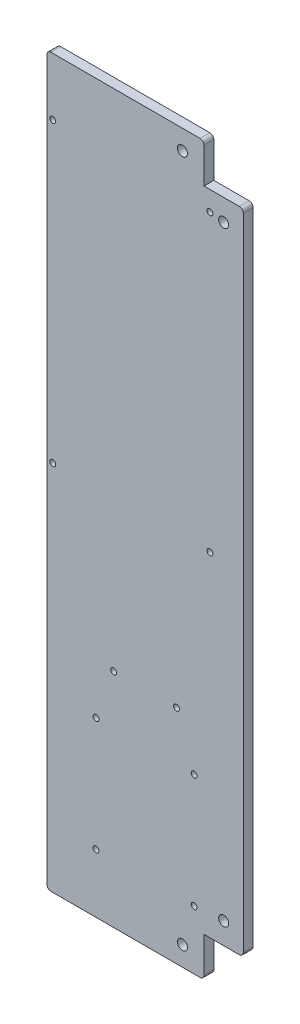
ISO-10303-21;
HEADER;
FILE_DESCRIPTION(('STEP AP214'),'2;1');
FILE_NAME('part.step','',(''),(''),'','','');
FILE_SCHEMA(('AUTOMOTIVE_DESIGN { 1 0 10303 214 1 1 1 1 }'));
ENDSEC;
DATA;
#1=APPLICATION_CONTEXT('core data for automotive mechanical design processes');
#2=APPLICATION_PROTOCOL_DEFINITION('international standard','automotive_design',2000,#1);
#3=PRODUCT_CONTEXT('',#1,'mechanical');
#4=PRODUCT('Part','Part','',(#3));
#5=PRODUCT_RELATED_PRODUCT_CATEGORY('part','',(#4));
#6=PRODUCT_DEFINITION_FORMATION('','',#4);
#7=PRODUCT_DEFINITION_CONTEXT('part definition',#1,'design');
#8=PRODUCT_DEFINITION('design','',#6,#7);
#9=PRODUCT_DEFINITION_SHAPE('','',#8);
#10=(LENGTH_UNIT() NAMED_UNIT(*) SI_UNIT(.MILLI.,.METRE.));
#11=(NAMED_UNIT(*) PLANE_ANGLE_UNIT() SI_UNIT($,.RADIAN.));
#12=(NAMED_UNIT(*) SI_UNIT($,.STERADIAN.) SOLID_ANGLE_UNIT());
#13=UNCERTAINTY_MEASURE_WITH_UNIT(LENGTH_MEASURE(1.E-05),#10,'distance_accuracy_value','');
#14=(GEOMETRIC_REPRESENTATION_CONTEXT(3) GLOBAL_UNCERTAINTY_ASSIGNED_CONTEXT((#13)) GLOBAL_UNIT_ASSIGNED_CONTEXT((#10,
#11,#12)) REPRESENTATION_CONTEXT('',''));
#15=CARTESIAN_POINT('',(0.,0.,0.));
#16=DIRECTION('',(0.,0.,1.));
#17=DIRECTION('',(1.,0.,0.));
#18=AXIS2_PLACEMENT_3D('',#15,#16,#17);
#19=CARTESIAN_POINT('',(0.,0.,2.5));
#20=DIRECTION('',(0.,0.,1.));
#21=DIRECTION('',(1.,0.,0.));
#22=AXIS2_PLACEMENT_3D('',#19,#20,#21);
#23=PLANE('',#22);
#24=CARTESIAN_POINT('',(-16.,-71.9999999999997,2.5));
#25=DIRECTION('',(0.,0.,1.));
#26=DIRECTION('',(1.,0.,0.));
#27=AXIS2_PLACEMENT_3D('',#24,#25,#26);
#28=CIRCLE('',#27,1.5);
#29=CARTESIAN_POINT('',(-17.5,-71.9999999999997,2.5));
#30=VERTEX_POINT('',#29);
#31=EDGE_CURVE('E477',#30,#30,#28,.F.);
#32=ORIENTED_EDGE('',*,*,#31,.T.);
#33=EDGE_LOOP('',(#32));
#34=FACE_BOUND('',#33,.T.);
#35=CARTESIAN_POINT('',(19.0000000000886,174.999999999955,2.5));
#36=DIRECTION('',(0.,0.,-1.));
#37=DIRECTION('',(-1.,0.,0.));
#38=AXIS2_PLACEMENT_3D('',#35,#36,#37);
#39=CIRCLE('',#38,2.55000000009726);
#40=CARTESIAN_POINT('',(16.4499999999913,174.999999999955,2.5));
#41=VERTEX_POINT('',#40);
#42=EDGE_CURVE('E185',#41,#41,#39,.T.);
#43=ORIENTED_EDGE('',*,*,#42,.T.);
#44=EDGE_LOOP('',(#43));
#45=FACE_BOUND('',#44,.T.);
#46=CARTESIAN_POINT('',(40.0000000002187,153.999999999926,2.5));
#47=DIRECTION('',(0.,0.,-1.));
#48=DIRECTION('',(-1.,0.,0.));
#49=AXIS2_PLACEMENT_3D('',#46,#47,#48);
#50=CIRCLE('',#49,2.55000000023076);
#51=CARTESIAN_POINT('',(37.4499999999879,153.999999999926,2.5));
#52=VERTEX_POINT('',#51);
#53=EDGE_CURVE('E459',#52,#52,#50,.T.);
#54=ORIENTED_EDGE('',*,*,#53,.T.);
#55=EDGE_LOOP('',(#54));
#56=FACE_BOUND('',#55,.T.);
#57=CARTESIAN_POINT('',(40.0000000002186,-154.000000000055,2.5));
#58=DIRECTION('',(0.,0.,-1.));
#59=DIRECTION('',(-1.,0.,0.));
#60=AXIS2_PLACEMENT_3D('',#57,#58,#59);
#61=CIRCLE('',#60,2.55000000022515);
#62=CARTESIAN_POINT('',(37.4499999999934,-154.000000000055,2.5));
#63=VERTEX_POINT('',#62);
#64=EDGE_CURVE('E451',#63,#63,#61,.T.);
#65=ORIENTED_EDGE('',*,*,#64,.T.);
#66=EDGE_LOOP('',(#65));
#67=FACE_BOUND('',#66,.T.);
#68=CARTESIAN_POINT('',(19.0000000002103,-175.000000000055,2.5));
#69=DIRECTION('',(0.,0.,-1.));
#70=DIRECTION('',(-1.,0.,0.));
#71=AXIS2_PLACEMENT_3D('',#68,#69,#70);
#72=CIRCLE('',#71,2.55000000021739);
#73=CARTESIAN_POINT('',(16.4499999999929,-175.000000000055,2.5));
#74=VERTEX_POINT('',#73);
#75=EDGE_CURVE('E442',#74,#74,#72,.T.);
#76=ORIENTED_EDGE('',*,*,#75,.T.);
#77=EDGE_LOOP('',(#76));
#78=FACE_BOUND('',#77,.T.);
#79=CARTESIAN_POINT('',(-25.,-155.,2.5));
#80=DIRECTION('',(0.,0.,1.));
#81=DIRECTION('',(-1.,0.,0.));
#82=AXIS2_PLACEMENT_3D('',#79,#80,#81);
#83=CIRCLE('',#82,1.5);
#84=CARTESIAN_POINT('',(-26.5,-155.,2.5));
#85=VERTEX_POINT('',#84);
#86=EDGE_CURVE('E202',#85,#85,#83,.T.);
#87=ORIENTED_EDGE('',*,*,#86,.F.);
#88=EDGE_LOOP('',(#87));
#89=FACE_BOUND('',#88,.T.);
#90=CARTESIAN_POINT('',(25.,-96.9999999999997,2.5));
#91=DIRECTION('',(0.,0.,1.));
#92=DIRECTION('',(-1.,0.,0.));
#93=AXIS2_PLACEMENT_3D('',#90,#91,#92);
#94=CIRCLE('',#93,1.5);
#95=CARTESIAN_POINT('',(23.5,-96.9999999999997,2.5));
#96=VERTEX_POINT('',#95);
#97=EDGE_CURVE('E211',#96,#96,#94,.T.);
#98=ORIENTED_EDGE('',*,*,#97,.F.);
#99=EDGE_LOOP('',(#98));
#100=FACE_BOUND('',#99,.T.);
#101=CARTESIAN_POINT('',(-25.,-96.9999999999997,2.5));
#102=DIRECTION('',(0.,0.,1.));
#103=DIRECTION('',(1.,0.,0.));
#104=AXIS2_PLACEMENT_3D('',#101,#102,#103);
#105=CIRCLE('',#104,1.5);
#106=CARTESIAN_POINT('',(-23.5,-96.9999999999997,2.5));
#107=VERTEX_POINT('',#106);
#108=EDGE_CURVE('E176',#107,#107,#105,.T.);
#109=ORIENTED_EDGE('',*,*,#108,.F.);
#110=EDGE_LOOP('',(#109));
#111=FACE_BOUND('',#110,.T.);
#112=CARTESIAN_POINT('',(25.,-155.,2.5));
#113=DIRECTION('',(0.,0.,1.));
#114=DIRECTION('',(1.,0.,0.));
#115=AXIS2_PLACEMENT_3D('',#112,#113,#114);
#116=CIRCLE('',#115,1.5);
#117=CARTESIAN_POINT('',(26.5,-155.,2.5));
#118=VERTEX_POINT('',#117);
#119=EDGE_CURVE('E206',#118,#118,#116,.T.);
#120=ORIENTED_EDGE('',*,*,#119,.F.);
#121=EDGE_LOOP('',(#120));
#122=FACE_BOUND('',#121,.T.);
#123=CARTESIAN_POINT('',(-47.,155.654762379244,2.5));
#124=DIRECTION('',(0.,0.,1.));
#125=DIRECTION('',(-1.,0.,0.));
#126=AXIS2_PLACEMENT_3D('',#123,#124,#125);
#127=CIRCLE('',#126,1.5);
#128=CARTESIAN_POINT('',(-48.5,155.654762379244,2.5));
#129=VERTEX_POINT('',#128);
#130=EDGE_CURVE('E234',#129,#129,#127,.T.);
#131=ORIENTED_EDGE('',*,*,#130,.F.);
#132=EDGE_LOOP('',(#131));
#133=FACE_BOUND('',#132,.T.);
#134=CARTESIAN_POINT('',(33.,5.,2.5));
#135=DIRECTION('',(0.,0.,1.));
#136=DIRECTION('',(-1.,0.,0.));
#137=AXIS2_PLACEMENT_3D('',#134,#135,#136);
#138=CIRCLE('',#137,1.5);
#139=CARTESIAN_POINT('',(31.5,5.,2.5));
#140=VERTEX_POINT('',#139);
#141=EDGE_CURVE('E243',#140,#140,#138,.T.);
#142=ORIENTED_EDGE('',*,*,#141,.F.);
#143=EDGE_LOOP('',(#142));
#144=FACE_BOUND('',#143,.T.);
#145=CARTESIAN_POINT('',(-47.,4.34523762075609,2.5));
#146=DIRECTION('',(0.,0.,1.));
#147=DIRECTION('',(1.,0.,0.));
#148=AXIS2_PLACEMENT_3D('',#145,#146,#147);
#149=CIRCLE('',#148,1.5);
#150=CARTESIAN_POINT('',(-45.5,4.34523762075609,2.5));
#151=VERTEX_POINT('',#150);
#152=EDGE_CURVE('E226',#151,#151,#149,.T.);
#153=ORIENTED_EDGE('',*,*,#152,.F.);
#154=EDGE_LOOP('',(#153));
#155=FACE_BOUND('',#154,.T.);
#156=CARTESIAN_POINT('',(33.,155.,2.5));
#157=DIRECTION('',(0.,0.,1.));
#158=DIRECTION('',(1.,0.,0.));
#159=AXIS2_PLACEMENT_3D('',#156,#157,#158);
#160=CIRCLE('',#159,1.5);
#161=CARTESIAN_POINT('',(34.5,155.,2.5));
#162=VERTEX_POINT('',#161);
#163=EDGE_CURVE('E238',#162,#162,#160,.T.);
#164=ORIENTED_EDGE('',*,*,#163,.F.);
#165=EDGE_LOOP('',(#164));
#166=FACE_BOUND('',#165,.T.);
#167=DIRECTION('',(1.,0.,0.));
#168=VECTOR('',#167,1.);
#169=CARTESIAN_POINT('',(50.,-185.,2.5));
#170=LINE('',#169,#168);
#171=CARTESIAN_POINT('',(-48.,-185.,2.5));
#172=VERTEX_POINT('',#171);
#173=CARTESIAN_POINT('',(28.,-185.,2.5));
#174=VERTEX_POINT('',#173);
#175=EDGE_CURVE('E262',#172,#174,#170,.T.);
#176=ORIENTED_EDGE('',*,*,#175,.T.);
#177=CARTESIAN_POINT('',(28.,-183.,2.5));
#178=DIRECTION('',(0.,0.,1.));
#179=DIRECTION('',(1.,0.,0.));
#180=AXIS2_PLACEMENT_3D('',#177,#178,#179);
#181=CIRCLE('',#180,2.);
#182=CARTESIAN_POINT('',(30.,-183.,2.5));
#183=VERTEX_POINT('',#182);
#184=EDGE_CURVE('E308',#174,#183,#181,.T.);
#185=ORIENTED_EDGE('',*,*,#184,.T.);
#186=DIRECTION('',(0.,1.,0.));
#187=VECTOR('',#186,1.);
#188=CARTESIAN_POINT('',(30.,-185.,2.5));
#189=LINE('',#188,#187);
#190=CARTESIAN_POINT('',(30.,-165.,2.5));
#191=VERTEX_POINT('',#190);
#192=EDGE_CURVE('E164',#183,#191,#189,.T.);
#193=ORIENTED_EDGE('',*,*,#192,.T.);
#194=DIRECTION('',(-1.,0.,0.));
#195=VECTOR('',#194,1.);
#196=CARTESIAN_POINT('',(50.,-165.,2.5));
#197=LINE('',#196,#195);
#198=CARTESIAN_POINT('',(48.,-165.,2.5));
#199=VERTEX_POINT('',#198);
#200=EDGE_CURVE('E186',#199,#191,#197,.T.);
#201=ORIENTED_EDGE('',*,*,#200,.F.);
#202=CARTESIAN_POINT('',(48.,-163.,2.5));
#203=DIRECTION('',(0.,0.,1.));
#204=DIRECTION('',(1.,0.,0.));
#205=AXIS2_PLACEMENT_3D('',#202,#203,#204);
#206=CIRCLE('',#205,2.);
#207=CARTESIAN_POINT('',(50.,-163.,2.5));
#208=VERTEX_POINT('',#207);
#209=EDGE_CURVE('E305',#199,#208,#206,.T.);
#210=ORIENTED_EDGE('',*,*,#209,.T.);
#211=DIRECTION('',(0.,1.,0.));
#212=VECTOR('',#211,1.);
#213=CARTESIAN_POINT('',(50.,-185.,2.5));
#214=LINE('',#213,#212);
#215=CARTESIAN_POINT('',(50.,163.,2.5));
#216=VERTEX_POINT('',#215);
#217=EDGE_CURVE('E266',#208,#216,#214,.T.);
#218=ORIENTED_EDGE('',*,*,#217,.T.);
#219=CARTESIAN_POINT('',(48.,163.,2.5));
#220=DIRECTION('',(0.,0.,1.));
#221=DIRECTION('',(1.,0.,0.));
#222=AXIS2_PLACEMENT_3D('',#219,#220,#221);
#223=CIRCLE('',#222,2.);
#224=CARTESIAN_POINT('',(48.,165.,2.5));
#225=VERTEX_POINT('',#224);
#226=EDGE_CURVE('E160',#216,#225,#223,.T.);
#227=ORIENTED_EDGE('',*,*,#226,.T.);
#228=DIRECTION('',(-1.,0.,0.));
#229=VECTOR('',#228,1.);
#230=CARTESIAN_POINT('',(50.,165.,2.5));
#231=LINE('',#230,#229);
#232=CARTESIAN_POINT('',(30.,165.,2.5));
#233=VERTEX_POINT('',#232);
#234=EDGE_CURVE('E154',#225,#233,#231,.T.);
#235=ORIENTED_EDGE('',*,*,#234,.T.);
#236=DIRECTION('',(0.,-1.,0.));
#237=VECTOR('',#236,1.);
#238=CARTESIAN_POINT('',(30.,185.,2.5));
#239=LINE('',#238,#237);
#240=CARTESIAN_POINT('',(30.,183.,2.5));
#241=VERTEX_POINT('',#240);
#242=EDGE_CURVE('E144',#241,#233,#239,.T.);
#243=ORIENTED_EDGE('',*,*,#242,.F.);
#244=CARTESIAN_POINT('',(28.,183.,2.5));
#245=DIRECTION('',(0.,0.,1.));
#246=DIRECTION('',(1.,0.,0.));
#247=AXIS2_PLACEMENT_3D('',#244,#245,#246);
#248=CIRCLE('',#247,2.);
#249=CARTESIAN_POINT('',(28.,185.,2.5));
#250=VERTEX_POINT('',#249);
#251=EDGE_CURVE('E300',#241,#250,#248,.T.);
#252=ORIENTED_EDGE('',*,*,#251,.T.);
#253=DIRECTION('',(-1.,0.,0.));
#254=VECTOR('',#253,1.);
#255=CARTESIAN_POINT('',(50.,185.,2.5));
#256=LINE('',#255,#254);
#257=CARTESIAN_POINT('',(-48.,185.,2.5));
#258=VERTEX_POINT('',#257);
#259=EDGE_CURVE('E269',#250,#258,#256,.T.);
#260=ORIENTED_EDGE('',*,*,#259,.T.);
#261=CARTESIAN_POINT('',(-48.,183.,2.5));
#262=DIRECTION('',(0.,0.,1.));
#263=DIRECTION('',(1.,0.,0.));
#264=AXIS2_PLACEMENT_3D('',#261,#262,#263);
#265=CIRCLE('',#264,2.);
#266=CARTESIAN_POINT('',(-50.,183.,2.5));
#267=VERTEX_POINT('',#266);
#268=EDGE_CURVE('E294',#258,#267,#265,.T.);
#269=ORIENTED_EDGE('',*,*,#268,.T.);
#270=DIRECTION('',(0.,-1.,0.));
#271=VECTOR('',#270,1.);
#272=CARTESIAN_POINT('',(-50.,-185.,2.5));
#273=LINE('',#272,#271);
#274=CARTESIAN_POINT('',(-50.,-183.,2.5));
#275=VERTEX_POINT('',#274);
#276=EDGE_CURVE('E258',#267,#275,#273,.T.);
#277=ORIENTED_EDGE('',*,*,#276,.T.);
#278=CARTESIAN_POINT('',(-48.,-183.,2.5));
#279=DIRECTION('',(0.,0.,1.));
#280=DIRECTION('',(1.,0.,0.));
#281=AXIS2_PLACEMENT_3D('',#278,#279,#280);
#282=CIRCLE('',#281,2.);
#283=EDGE_CURVE('E297',#275,#172,#282,.T.);
#284=ORIENTED_EDGE('',*,*,#283,.T.);
#285=EDGE_LOOP('',(#176,#185,#193,#201,#210,#218,#227,#235,#243,#252,#260,#269,#277,#284));
#286=FACE_BOUND('',#285,.T.);
#287=CARTESIAN_POINT('',(16.,-71.9999999999997,2.5));
#288=DIRECTION('',(0.,0.,1.));
#289=DIRECTION('',(1.,0.,0.));
#290=AXIS2_PLACEMENT_3D('',#287,#288,#289);
#291=CIRCLE('',#290,1.5);
#292=CARTESIAN_POINT('',(14.5,-71.9999999999997,2.5));
#293=VERTEX_POINT('',#292);
#294=EDGE_CURVE('E447',#293,#293,#291,.T.);
#295=ORIENTED_EDGE('',*,*,#294,.F.);
#296=EDGE_LOOP('',(#295));
#297=FACE_BOUND('',#296,.T.);
#298=ADVANCED_FACE('F42',(#34,#45,#56,#67,#78,#89,#100,#111,#122,#133,#144,#155,#166,#286,#297),
#23,.T.);
#299=CARTESIAN_POINT('',(0.,0.,-2.5));
#300=DIRECTION('',(0.,0.,1.));
#301=DIRECTION('',(1.,0.,0.));
#302=AXIS2_PLACEMENT_3D('',#299,#300,#301);
#303=PLANE('',#302);
#304=DIRECTION('',(0.,1.,0.));
#305=VECTOR('',#304,1.);
#306=CARTESIAN_POINT('',(30.,-185.,-2.5));
#307=LINE('',#306,#305);
#308=CARTESIAN_POINT('',(30.,-183.,-2.5));
#309=VERTEX_POINT('',#308);
#310=CARTESIAN_POINT('',(30.,-165.,-2.5));
#311=VERTEX_POINT('',#310);
#312=EDGE_CURVE('E189',#309,#311,#307,.T.);
#313=ORIENTED_EDGE('',*,*,#312,.F.);
#314=CARTESIAN_POINT('',(28.,-183.,-2.5));
#315=DIRECTION('',(0.,0.,1.));
#316=DIRECTION('',(1.,0.,0.));
#317=AXIS2_PLACEMENT_3D('',#314,#315,#316);
#318=CIRCLE('',#317,2.);
#319=CARTESIAN_POINT('',(28.,-185.,-2.5));
#320=VERTEX_POINT('',#319);
#321=EDGE_CURVE('E327',#309,#320,#318,.F.);
#322=ORIENTED_EDGE('',*,*,#321,.T.);
#323=DIRECTION('',(1.,0.,0.));
#324=VECTOR('',#323,1.);
#325=CARTESIAN_POINT('',(50.,-185.,-2.5));
#326=LINE('',#325,#324);
#327=CARTESIAN_POINT('',(-48.,-185.,-2.5));
#328=VERTEX_POINT('',#327);
#329=EDGE_CURVE('E277',#328,#320,#326,.T.);
#330=ORIENTED_EDGE('',*,*,#329,.F.);
#331=CARTESIAN_POINT('',(-48.,-183.,-2.5));
#332=DIRECTION('',(0.,0.,1.));
#333=DIRECTION('',(1.,0.,0.));
#334=AXIS2_PLACEMENT_3D('',#331,#332,#333);
#335=CIRCLE('',#334,2.);
#336=CARTESIAN_POINT('',(-50.,-183.,-2.5));
#337=VERTEX_POINT('',#336);
#338=EDGE_CURVE('E316',#328,#337,#335,.F.);
#339=ORIENTED_EDGE('',*,*,#338,.T.);
#340=DIRECTION('',(0.,-1.,0.));
#341=VECTOR('',#340,1.);
#342=CARTESIAN_POINT('',(-50.,-185.,-2.5));
#343=LINE('',#342,#341);
#344=CARTESIAN_POINT('',(-50.,183.,-2.5));
#345=VERTEX_POINT('',#344);
#346=EDGE_CURVE('E254',#345,#337,#343,.T.);
#347=ORIENTED_EDGE('',*,*,#346,.F.);
#348=CARTESIAN_POINT('',(-48.,183.,-2.5));
#349=DIRECTION('',(0.,0.,1.));
#350=DIRECTION('',(1.,0.,0.));
#351=AXIS2_PLACEMENT_3D('',#348,#349,#350);
#352=CIRCLE('',#351,2.);
#353=CARTESIAN_POINT('',(-48.,185.,-2.5));
#354=VERTEX_POINT('',#353);
#355=EDGE_CURVE('E64',#345,#354,#352,.F.);
#356=ORIENTED_EDGE('',*,*,#355,.T.);
#357=DIRECTION('',(-1.,0.,0.));
#358=VECTOR('',#357,1.);
#359=CARTESIAN_POINT('',(50.,185.,-2.5));
#360=LINE('',#359,#358);
#361=CARTESIAN_POINT('',(28.,185.,-2.5));
#362=VERTEX_POINT('',#361);
#363=EDGE_CURVE('E263',#362,#354,#360,.T.);
#364=ORIENTED_EDGE('',*,*,#363,.F.);
#365=CARTESIAN_POINT('',(28.,183.,-2.5));
#366=DIRECTION('',(0.,0.,1.));
#367=DIRECTION('',(1.,0.,0.));
#368=AXIS2_PLACEMENT_3D('',#365,#366,#367);
#369=CIRCLE('',#368,2.);
#370=CARTESIAN_POINT('',(30.,183.,-2.5));
#371=VERTEX_POINT('',#370);
#372=EDGE_CURVE('E58',#362,#371,#369,.F.);
#373=ORIENTED_EDGE('',*,*,#372,.T.);
#374=DIRECTION('',(0.,-1.,0.));
#375=VECTOR('',#374,1.);
#376=CARTESIAN_POINT('',(30.,185.,-2.5));
#377=LINE('',#376,#375);
#378=CARTESIAN_POINT('',(30.,165.,-2.5));
#379=VERTEX_POINT('',#378);
#380=EDGE_CURVE('E171',#371,#379,#377,.T.);
#381=ORIENTED_EDGE('',*,*,#380,.T.);
#382=DIRECTION('',(-1.,0.,0.));
#383=VECTOR('',#382,1.);
#384=CARTESIAN_POINT('',(50.,165.,-2.5));
#385=LINE('',#384,#383);
#386=CARTESIAN_POINT('',(48.,165.,-2.5));
#387=VERTEX_POINT('',#386);
#388=EDGE_CURVE('E153',#387,#379,#385,.T.);
#389=ORIENTED_EDGE('',*,*,#388,.F.);
#390=CARTESIAN_POINT('',(48.,163.,-2.5));
#391=DIRECTION('',(0.,0.,1.));
#392=DIRECTION('',(1.,0.,0.));
#393=AXIS2_PLACEMENT_3D('',#390,#391,#392);
#394=CIRCLE('',#393,2.);
#395=CARTESIAN_POINT('',(50.,163.,-2.5));
#396=VERTEX_POINT('',#395);
#397=EDGE_CURVE('E321',#387,#396,#394,.F.);
#398=ORIENTED_EDGE('',*,*,#397,.T.);
#399=DIRECTION('',(0.,1.,0.));
#400=VECTOR('',#399,1.);
#401=CARTESIAN_POINT('',(50.,-185.,-2.5));
#402=LINE('',#401,#400);
#403=CARTESIAN_POINT('',(50.,-163.,-2.5));
#404=VERTEX_POINT('',#403);
#405=EDGE_CURVE('E281',#404,#396,#402,.T.);
#406=ORIENTED_EDGE('',*,*,#405,.F.);
#407=CARTESIAN_POINT('',(48.,-163.,-2.5));
#408=DIRECTION('',(0.,0.,1.));
#409=DIRECTION('',(1.,0.,0.));
#410=AXIS2_PLACEMENT_3D('',#407,#408,#409);
#411=CIRCLE('',#410,2.);
#412=CARTESIAN_POINT('',(48.,-165.,-2.5));
#413=VERTEX_POINT('',#412);
#414=EDGE_CURVE('E324',#404,#413,#411,.F.);
#415=ORIENTED_EDGE('',*,*,#414,.T.);
#416=DIRECTION('',(-1.,0.,0.));
#417=VECTOR('',#416,1.);
#418=CARTESIAN_POINT('',(50.,-165.,-2.5));
#419=LINE('',#418,#417);
#420=EDGE_CURVE('E184',#413,#311,#419,.T.);
#421=ORIENTED_EDGE('',*,*,#420,.T.);
#422=EDGE_LOOP('',(#313,#322,#330,#339,#347,#356,#364,#373,#381,#389,#398,#406,#415,#421));
#423=FACE_BOUND('',#422,.T.);
#424=CARTESIAN_POINT('',(33.,155.,-2.5));
#425=DIRECTION('',(0.,0.,1.));
#426=DIRECTION('',(1.,0.,0.));
#427=AXIS2_PLACEMENT_3D('',#424,#425,#426);
#428=CIRCLE('',#427,1.5);
#429=CARTESIAN_POINT('',(34.5,155.,-2.5));
#430=VERTEX_POINT('',#429);
#431=EDGE_CURVE('E250',#430,#430,#428,.T.);
#432=ORIENTED_EDGE('',*,*,#431,.T.);
#433=EDGE_LOOP('',(#432));
#434=FACE_BOUND('',#433,.T.);
#435=CARTESIAN_POINT('',(-47.,4.34523762075609,-2.5));
#436=DIRECTION('',(0.,0.,1.));
#437=DIRECTION('',(1.,0.,0.));
#438=AXIS2_PLACEMENT_3D('',#435,#436,#437);
#439=CIRCLE('',#438,1.5);
#440=CARTESIAN_POINT('',(-45.5,4.34523762075609,-2.5));
#441=VERTEX_POINT('',#440);
#442=EDGE_CURVE('E222',#441,#441,#439,.T.);
#443=ORIENTED_EDGE('',*,*,#442,.T.);
#444=EDGE_LOOP('',(#443));
#445=FACE_BOUND('',#444,.T.);
#446=CARTESIAN_POINT('',(33.,5.,-2.5));
#447=DIRECTION('',(0.,0.,1.));
#448=DIRECTION('',(-1.,0.,0.));
#449=AXIS2_PLACEMENT_3D('',#446,#447,#448);
#450=CIRCLE('',#449,1.5);
#451=CARTESIAN_POINT('',(31.5,5.,-2.5));
#452=VERTEX_POINT('',#451);
#453=EDGE_CURVE('E230',#452,#452,#450,.T.);
#454=ORIENTED_EDGE('',*,*,#453,.T.);
#455=EDGE_LOOP('',(#454));
#456=FACE_BOUND('',#455,.T.);
#457=CARTESIAN_POINT('',(-47.,155.654762379244,-2.5));
#458=DIRECTION('',(0.,0.,1.));
#459=DIRECTION('',(-1.,0.,0.));
#460=AXIS2_PLACEMENT_3D('',#457,#458,#459);
#461=CIRCLE('',#460,1.5);
#462=CARTESIAN_POINT('',(-48.5,155.654762379244,-2.5));
#463=VERTEX_POINT('',#462);
#464=EDGE_CURVE('E239',#463,#463,#461,.T.);
#465=ORIENTED_EDGE('',*,*,#464,.T.);
#466=EDGE_LOOP('',(#465));
#467=FACE_BOUND('',#466,.T.);
#468=CARTESIAN_POINT('',(25.,-155.,-2.5));
#469=DIRECTION('',(0.,0.,1.));
#470=DIRECTION('',(1.,0.,0.));
#471=AXIS2_PLACEMENT_3D('',#468,#469,#470);
#472=CIRCLE('',#471,1.5);
#473=CARTESIAN_POINT('',(26.5,-155.,-2.5));
#474=VERTEX_POINT('',#473);
#475=EDGE_CURVE('E218',#474,#474,#472,.T.);
#476=ORIENTED_EDGE('',*,*,#475,.T.);
#477=EDGE_LOOP('',(#476));
#478=FACE_BOUND('',#477,.T.);
#479=CARTESIAN_POINT('',(-25.,-96.9999999999997,-2.5));
#480=DIRECTION('',(0.,0.,1.));
#481=DIRECTION('',(1.,0.,0.));
#482=AXIS2_PLACEMENT_3D('',#479,#480,#481);
#483=CIRCLE('',#482,1.5);
#484=CARTESIAN_POINT('',(-23.5,-96.9999999999997,-2.5));
#485=VERTEX_POINT('',#484);
#486=EDGE_CURVE('E170',#485,#485,#483,.T.);
#487=ORIENTED_EDGE('',*,*,#486,.T.);
#488=EDGE_LOOP('',(#487));
#489=FACE_BOUND('',#488,.T.);
#490=CARTESIAN_POINT('',(25.,-96.9999999999997,-2.5));
#491=DIRECTION('',(0.,0.,1.));
#492=DIRECTION('',(-1.,0.,0.));
#493=AXIS2_PLACEMENT_3D('',#490,#491,#492);
#494=CIRCLE('',#493,1.5);
#495=CARTESIAN_POINT('',(23.5,-96.9999999999997,-2.5));
#496=VERTEX_POINT('',#495);
#497=EDGE_CURVE('E200',#496,#496,#494,.T.);
#498=ORIENTED_EDGE('',*,*,#497,.T.);
#499=EDGE_LOOP('',(#498));
#500=FACE_BOUND('',#499,.T.);
#501=CARTESIAN_POINT('',(-25.,-155.,-2.5));
#502=DIRECTION('',(0.,0.,1.));
#503=DIRECTION('',(-1.,0.,0.));
#504=AXIS2_PLACEMENT_3D('',#501,#502,#503);
#505=CIRCLE('',#504,1.5);
#506=CARTESIAN_POINT('',(-26.5,-155.,-2.5));
#507=VERTEX_POINT('',#506);
#508=EDGE_CURVE('E207',#507,#507,#505,.T.);
#509=ORIENTED_EDGE('',*,*,#508,.T.);
#510=EDGE_LOOP('',(#509));
#511=FACE_BOUND('',#510,.T.);
#512=CARTESIAN_POINT('',(19.0000000002103,-175.000000000055,-2.5));
#513=DIRECTION('',(0.,0.,-1.));
#514=DIRECTION('',(-1.,0.,0.));
#515=AXIS2_PLACEMENT_3D('',#512,#513,#514);
#516=CIRCLE('',#515,2.55000000021739);
#517=CARTESIAN_POINT('',(16.4499999999929,-175.000000000055,-2.5));
#518=VERTEX_POINT('',#517);
#519=EDGE_CURVE('E446',#518,#518,#516,.T.);
#520=ORIENTED_EDGE('',*,*,#519,.F.);
#521=EDGE_LOOP('',(#520));
#522=FACE_BOUND('',#521,.T.);
#523=CARTESIAN_POINT('',(40.0000000002186,-154.000000000055,-2.5));
#524=DIRECTION('',(0.,0.,-1.));
#525=DIRECTION('',(-1.,0.,0.));
#526=AXIS2_PLACEMENT_3D('',#523,#524,#525);
#527=CIRCLE('',#526,2.55000000022515);
#528=CARTESIAN_POINT('',(37.4499999999934,-154.000000000055,-2.5));
#529=VERTEX_POINT('',#528);
#530=EDGE_CURVE('E455',#529,#529,#527,.T.);
#531=ORIENTED_EDGE('',*,*,#530,.F.);
#532=EDGE_LOOP('',(#531));
#533=FACE_BOUND('',#532,.T.);
#534=CARTESIAN_POINT('',(40.0000000002187,153.999999999926,-2.5));
#535=DIRECTION('',(0.,0.,-1.));
#536=DIRECTION('',(-1.,0.,0.));
#537=AXIS2_PLACEMENT_3D('',#534,#535,#536);
#538=CIRCLE('',#537,2.55000000023076);
#539=CARTESIAN_POINT('',(37.4499999999879,153.999999999926,-2.5));
#540=VERTEX_POINT('',#539);
#541=EDGE_CURVE('E463',#540,#540,#538,.T.);
#542=ORIENTED_EDGE('',*,*,#541,.F.);
#543=EDGE_LOOP('',(#542));
#544=FACE_BOUND('',#543,.T.);
#545=CARTESIAN_POINT('',(19.0000000000886,174.999999999955,-2.5));
#546=DIRECTION('',(0.,0.,-1.));
#547=DIRECTION('',(-1.,0.,0.));
#548=AXIS2_PLACEMENT_3D('',#545,#546,#547);
#549=CIRCLE('',#548,2.55000000009726);
#550=CARTESIAN_POINT('',(16.4499999999913,174.999999999955,-2.5));
#551=VERTEX_POINT('',#550);
#552=EDGE_CURVE('E467',#551,#551,#549,.T.);
#553=ORIENTED_EDGE('',*,*,#552,.F.);
#554=EDGE_LOOP('',(#553));
#555=FACE_BOUND('',#554,.T.);
#556=CARTESIAN_POINT('',(-16.,-71.9999999999997,-2.5));
#557=DIRECTION('',(0.,0.,-1.));
#558=DIRECTION('',(-1.,0.,0.));
#559=AXIS2_PLACEMENT_3D('',#556,#557,#558);
#560=CIRCLE('',#559,1.5);
#561=CARTESIAN_POINT('',(-17.5,-71.9999999999997,-2.5));
#562=VERTEX_POINT('',#561);
#563=EDGE_CURVE('E481',#562,#562,#560,.F.);
#564=ORIENTED_EDGE('',*,*,#563,.T.);
#565=EDGE_LOOP('',(#564));
#566=FACE_BOUND('',#565,.T.);
#567=CARTESIAN_POINT('',(16.,-71.9999999999997,-2.5));
#568=DIRECTION('',(0.,0.,-1.));
#569=DIRECTION('',(-1.,0.,0.));
#570=AXIS2_PLACEMENT_3D('',#567,#568,#569);
#571=CIRCLE('',#570,1.5);
#572=CARTESIAN_POINT('',(14.5,-71.9999999999997,-2.5));
#573=VERTEX_POINT('',#572);
#574=EDGE_CURVE('E480',#573,#573,#571,.T.);
#575=ORIENTED_EDGE('',*,*,#574,.F.);
#576=EDGE_LOOP('',(#575));
#577=FACE_BOUND('',#576,.T.);
#578=ADVANCED_FACE('F361',(#423,#434,#445,#456,#467,#478,#489,#500,#511,#522,#533,#544,#555,
#566,#577),#303,.F.);
#579=CARTESIAN_POINT('',(50.,-185.,2.5));
#580=DIRECTION('',(0.,1.,0.));
#581=DIRECTION('',(0.,0.,1.));
#582=AXIS2_PLACEMENT_3D('',#579,#580,#581);
#583=PLANE('',#582);
#584=ORIENTED_EDGE('',*,*,#329,.T.);
#585=DIRECTION('',(0.,0.,1.));
#586=VECTOR('',#585,1.);
#587=CARTESIAN_POINT('',(28.,-185.,2.5));
#588=LINE('',#587,#586);
#589=EDGE_CURVE('E290',#320,#174,#588,.T.);
#590=ORIENTED_EDGE('',*,*,#589,.T.);
#591=ORIENTED_EDGE('',*,*,#175,.F.);
#592=DIRECTION('',(0.,0.,-1.));
#593=VECTOR('',#592,1.);
#594=CARTESIAN_POINT('',(-48.,-185.,2.5));
#595=LINE('',#594,#593);
#596=EDGE_CURVE('E273',#172,#328,#595,.T.);
#597=ORIENTED_EDGE('',*,*,#596,.T.);
#598=EDGE_LOOP('',(#584,#590,#591,#597));
#599=FACE_BOUND('',#598,.T.);
#600=ADVANCED_FACE('F370',(#599),#583,.F.);
#601=CARTESIAN_POINT('',(50.,-185.,2.5));
#602=DIRECTION('',(-1.,0.,0.));
#603=DIRECTION('',(0.,0.,1.));
#604=AXIS2_PLACEMENT_3D('',#601,#602,#603);
#605=PLANE('',#604);
#606=ORIENTED_EDGE('',*,*,#217,.F.);
#607=DIRECTION('',(0.,0.,1.));
#608=VECTOR('',#607,1.);
#609=CARTESIAN_POINT('',(50.,-163.,2.5));
#610=LINE('',#609,#608);
#611=EDGE_CURVE('E338',#208,#404,#610,.F.);
#612=ORIENTED_EDGE('',*,*,#611,.T.);
#613=ORIENTED_EDGE('',*,*,#405,.T.);
#614=DIRECTION('',(0.,0.,1.));
#615=VECTOR('',#614,1.);
#616=CARTESIAN_POINT('',(50.,163.,2.5));
#617=LINE('',#616,#615);
#618=EDGE_CURVE('E334',#396,#216,#617,.T.);
#619=ORIENTED_EDGE('',*,*,#618,.T.);
#620=EDGE_LOOP('',(#606,#612,#613,#619));
#621=FACE_BOUND('',#620,.T.);
#622=ADVANCED_FACE('F406',(#621),#605,.F.);
#623=CARTESIAN_POINT('',(-50.,-185.,2.5));
#624=DIRECTION('',(1.,0.,0.));
#625=DIRECTION('',(0.,0.,-1.));
#626=AXIS2_PLACEMENT_3D('',#623,#624,#625);
#627=PLANE('',#626);
#628=ORIENTED_EDGE('',*,*,#346,.T.);
#629=DIRECTION('',(0.,0.,-1.));
#630=VECTOR('',#629,1.);
#631=CARTESIAN_POINT('',(-50.,-183.,2.5));
#632=LINE('',#631,#630);
#633=EDGE_CURVE('E11',#337,#275,#632,.F.);
#634=ORIENTED_EDGE('',*,*,#633,.T.);
#635=ORIENTED_EDGE('',*,*,#276,.F.);
#636=DIRECTION('',(0.,0.,-1.));
#637=VECTOR('',#636,1.);
#638=CARTESIAN_POINT('',(-50.,183.,2.5));
#639=LINE('',#638,#637);
#640=EDGE_CURVE('E51',#267,#345,#639,.T.);
#641=ORIENTED_EDGE('',*,*,#640,.T.);
#642=EDGE_LOOP('',(#628,#634,#635,#641));
#643=FACE_BOUND('',#642,.T.);
#644=ADVANCED_FACE('F356',(#643),#627,.F.);
#645=CARTESIAN_POINT('',(50.,185.,2.5));
#646=DIRECTION('',(0.,-1.,0.));
#647=DIRECTION('',(0.,0.,-1.));
#648=AXIS2_PLACEMENT_3D('',#645,#646,#647);
#649=PLANE('',#648);
#650=ORIENTED_EDGE('',*,*,#259,.F.);
#651=DIRECTION('',(0.,0.,1.));
#652=VECTOR('',#651,1.);
#653=CARTESIAN_POINT('',(28.,185.,2.5));
#654=LINE('',#653,#652);
#655=EDGE_CURVE('E349',#250,#362,#654,.F.);
#656=ORIENTED_EDGE('',*,*,#655,.T.);
#657=ORIENTED_EDGE('',*,*,#363,.T.);
#658=DIRECTION('',(0.,0.,-1.));
#659=VECTOR('',#658,1.);
#660=CARTESIAN_POINT('',(-48.,185.,2.5));
#661=LINE('',#660,#659);
#662=EDGE_CURVE('E346',#354,#258,#661,.F.);
#663=ORIENTED_EDGE('',*,*,#662,.T.);
#664=EDGE_LOOP('',(#650,#656,#657,#663));
#665=FACE_BOUND('',#664,.T.);
#666=ADVANCED_FACE('F376',(#665),#649,.F.);
#667=CARTESIAN_POINT('',(33.,155.,-2.5));
#668=DIRECTION('',(0.,0.,1.));
#669=DIRECTION('',(1.,0.,0.));
#670=AXIS2_PLACEMENT_3D('',#667,#668,#669);
#671=CYLINDRICAL_SURFACE('',#670,1.5);
#672=ORIENTED_EDGE('',*,*,#431,.F.);
#673=EDGE_LOOP('',(#672));
#674=FACE_BOUND('',#673,.T.);
#675=ORIENTED_EDGE('',*,*,#163,.T.);
#676=EDGE_LOOP('',(#675));
#677=FACE_BOUND('',#676,.T.);
#678=ADVANCED_FACE('F401',(#674,#677),#671,.F.);
#679=CARTESIAN_POINT('',(-47.,4.34523762075609,-2.5));
#680=DIRECTION('',(0.,0.,1.));
#681=DIRECTION('',(1.,0.,0.));
#682=AXIS2_PLACEMENT_3D('',#679,#680,#681);
#683=CYLINDRICAL_SURFACE('',#682,1.5);
#684=ORIENTED_EDGE('',*,*,#442,.F.);
#685=EDGE_LOOP('',(#684));
#686=FACE_BOUND('',#685,.T.);
#687=ORIENTED_EDGE('',*,*,#152,.T.);
#688=EDGE_LOOP('',(#687));
#689=FACE_BOUND('',#688,.T.);
#690=ADVANCED_FACE('F541',(#686,#689),#683,.F.);
#691=CARTESIAN_POINT('',(33.,5.,-2.5));
#692=DIRECTION('',(0.,0.,1.));
#693=DIRECTION('',(1.,0.,0.));
#694=AXIS2_PLACEMENT_3D('',#691,#692,#693);
#695=CYLINDRICAL_SURFACE('',#694,1.5);
#696=ORIENTED_EDGE('',*,*,#453,.F.);
#697=EDGE_LOOP('',(#696));
#698=FACE_BOUND('',#697,.T.);
#699=ORIENTED_EDGE('',*,*,#141,.T.);
#700=EDGE_LOOP('',(#699));
#701=FACE_BOUND('',#700,.T.);
#702=ADVANCED_FACE('F544',(#698,#701),#695,.F.);
#703=CARTESIAN_POINT('',(-47.,155.654762379244,-2.5));
#704=DIRECTION('',(0.,0.,1.));
#705=DIRECTION('',(1.,0.,0.));
#706=AXIS2_PLACEMENT_3D('',#703,#704,#705);
#707=CYLINDRICAL_SURFACE('',#706,1.5);
#708=ORIENTED_EDGE('',*,*,#464,.F.);
#709=EDGE_LOOP('',(#708));
#710=FACE_BOUND('',#709,.T.);
#711=ORIENTED_EDGE('',*,*,#130,.T.);
#712=EDGE_LOOP('',(#711));
#713=FACE_BOUND('',#712,.T.);
#714=ADVANCED_FACE('F539',(#710,#713),#707,.F.);
#715=CARTESIAN_POINT('',(25.,-155.,-2.5));
#716=DIRECTION('',(0.,0.,1.));
#717=DIRECTION('',(1.,0.,0.));
#718=AXIS2_PLACEMENT_3D('',#715,#716,#717);
#719=CYLINDRICAL_SURFACE('',#718,1.5);
#720=ORIENTED_EDGE('',*,*,#475,.F.);
#721=EDGE_LOOP('',(#720));
#722=FACE_BOUND('',#721,.T.);
#723=ORIENTED_EDGE('',*,*,#119,.T.);
#724=EDGE_LOOP('',(#723));
#725=FACE_BOUND('',#724,.T.);
#726=ADVANCED_FACE('F529',(#722,#725),#719,.F.);
#727=CARTESIAN_POINT('',(-25.,-96.9999999999997,-2.5));
#728=DIRECTION('',(0.,0.,1.));
#729=DIRECTION('',(1.,0.,0.));
#730=AXIS2_PLACEMENT_3D('',#727,#728,#729);
#731=CYLINDRICAL_SURFACE('',#730,1.5);
#732=ORIENTED_EDGE('',*,*,#486,.F.);
#733=EDGE_LOOP('',(#732));
#734=FACE_BOUND('',#733,.T.);
#735=ORIENTED_EDGE('',*,*,#108,.T.);
#736=EDGE_LOOP('',(#735));
#737=FACE_BOUND('',#736,.T.);
#738=ADVANCED_FACE('F525',(#734,#737),#731,.F.);
#739=CARTESIAN_POINT('',(25.,-96.9999999999997,-2.5));
#740=DIRECTION('',(0.,0.,1.));
#741=DIRECTION('',(1.,0.,0.));
#742=AXIS2_PLACEMENT_3D('',#739,#740,#741);
#743=CYLINDRICAL_SURFACE('',#742,1.5);
#744=ORIENTED_EDGE('',*,*,#497,.F.);
#745=EDGE_LOOP('',(#744));
#746=FACE_BOUND('',#745,.T.);
#747=ORIENTED_EDGE('',*,*,#97,.T.);
#748=EDGE_LOOP('',(#747));
#749=FACE_BOUND('',#748,.T.);
#750=ADVANCED_FACE('F528',(#746,#749),#743,.F.);
#751=CARTESIAN_POINT('',(-25.,-155.,-2.5));
#752=DIRECTION('',(0.,0.,1.));
#753=DIRECTION('',(1.,0.,0.));
#754=AXIS2_PLACEMENT_3D('',#751,#752,#753);
#755=CYLINDRICAL_SURFACE('',#754,1.5);
#756=ORIENTED_EDGE('',*,*,#508,.F.);
#757=EDGE_LOOP('',(#756));
#758=FACE_BOUND('',#757,.T.);
#759=ORIENTED_EDGE('',*,*,#86,.T.);
#760=EDGE_LOOP('',(#759));
#761=FACE_BOUND('',#760,.T.);
#762=ADVANCED_FACE('F522',(#758,#761),#755,.F.);
#763=CARTESIAN_POINT('',(30.,-185.,-2.5));
#764=DIRECTION('',(1.,0.,0.));
#765=DIRECTION('',(0.,1.,0.));
#766=AXIS2_PLACEMENT_3D('',#763,#764,#765);
#767=PLANE('',#766);
#768=ORIENTED_EDGE('',*,*,#192,.F.);
#769=DIRECTION('',(0.,0.,1.));
#770=VECTOR('',#769,1.);
#771=CARTESIAN_POINT('',(30.,-183.,-2.5));
#772=LINE('',#771,#770);
#773=EDGE_CURVE('E311',#183,#309,#772,.F.);
#774=ORIENTED_EDGE('',*,*,#773,.T.);
#775=ORIENTED_EDGE('',*,*,#312,.T.);
#776=DIRECTION('',(0.,0.,1.));
#777=VECTOR('',#776,1.);
#778=CARTESIAN_POINT('',(30.,-165.,-2.5));
#779=LINE('',#778,#777);
#780=EDGE_CURVE('E180',#311,#191,#779,.T.);
#781=ORIENTED_EDGE('',*,*,#780,.T.);
#782=EDGE_LOOP('',(#768,#774,#775,#781));
#783=FACE_BOUND('',#782,.T.);
#784=ADVANCED_FACE('F433',(#783),#767,.T.);
#785=CARTESIAN_POINT('',(50.,-165.,-2.5));
#786=DIRECTION('',(0.,1.,0.));
#787=DIRECTION('',(0.,0.,1.));
#788=AXIS2_PLACEMENT_3D('',#785,#786,#787);
#789=PLANE('',#788);
#790=ORIENTED_EDGE('',*,*,#420,.F.);
#791=DIRECTION('',(0.,0.,1.));
#792=VECTOR('',#791,1.);
#793=CARTESIAN_POINT('',(48.,-165.,-2.5));
#794=LINE('',#793,#792);
#795=EDGE_CURVE('E330',#413,#199,#794,.T.);
#796=ORIENTED_EDGE('',*,*,#795,.T.);
#797=ORIENTED_EDGE('',*,*,#200,.T.);
#798=ORIENTED_EDGE('',*,*,#780,.F.);
#799=EDGE_LOOP('',(#790,#796,#797,#798));
#800=FACE_BOUND('',#799,.T.);
#801=ADVANCED_FACE('F430',(#800),#789,.F.);
#802=CARTESIAN_POINT('',(50.,165.,-2.5));
#803=DIRECTION('',(0.,1.,0.));
#804=DIRECTION('',(0.,0.,1.));
#805=AXIS2_PLACEMENT_3D('',#802,#803,#804);
#806=PLANE('',#805);
#807=ORIENTED_EDGE('',*,*,#234,.F.);
#808=DIRECTION('',(0.,0.,1.));
#809=VECTOR('',#808,1.);
#810=CARTESIAN_POINT('',(48.,165.,-2.5));
#811=LINE('',#810,#809);
#812=EDGE_CURVE('E341',#225,#387,#811,.F.);
#813=ORIENTED_EDGE('',*,*,#812,.T.);
#814=ORIENTED_EDGE('',*,*,#388,.T.);
#815=DIRECTION('',(0.,0.,1.));
#816=VECTOR('',#815,1.);
#817=CARTESIAN_POINT('',(30.,165.,-2.5));
#818=LINE('',#817,#816);
#819=EDGE_CURVE('E148',#379,#233,#818,.T.);
#820=ORIENTED_EDGE('',*,*,#819,.T.);
#821=EDGE_LOOP('',(#807,#813,#814,#820));
#822=FACE_BOUND('',#821,.T.);
#823=ADVANCED_FACE('F167',(#822),#806,.T.);
#824=CARTESIAN_POINT('',(30.,185.,-2.5));
#825=DIRECTION('',(-1.,0.,0.));
#826=DIRECTION('',(0.,-1.,0.));
#827=AXIS2_PLACEMENT_3D('',#824,#825,#826);
#828=PLANE('',#827);
#829=ORIENTED_EDGE('',*,*,#380,.F.);
#830=DIRECTION('',(0.,0.,1.));
#831=VECTOR('',#830,1.);
#832=CARTESIAN_POINT('',(30.,183.,-2.5));
#833=LINE('',#832,#831);
#834=EDGE_CURVE('E150',#371,#241,#833,.T.);
#835=ORIENTED_EDGE('',*,*,#834,.T.);
#836=ORIENTED_EDGE('',*,*,#242,.T.);
#837=ORIENTED_EDGE('',*,*,#819,.F.);
#838=EDGE_LOOP('',(#829,#835,#836,#837));
#839=FACE_BOUND('',#838,.T.);
#840=ADVANCED_FACE('F146',(#839),#828,.F.);
#841=CARTESIAN_POINT('',(19.0000000002103,-175.000000000055,2.5));
#842=DIRECTION('',(0.,0.,-1.));
#843=DIRECTION('',(-1.,0.,0.));
#844=AXIS2_PLACEMENT_3D('',#841,#842,#843);
#845=CYLINDRICAL_SURFACE('',#844,2.55000000021739);
#846=ORIENTED_EDGE('',*,*,#75,.F.);
#847=EDGE_LOOP('',(#846));
#848=FACE_BOUND('',#847,.T.);
#849=ORIENTED_EDGE('',*,*,#519,.T.);
#850=EDGE_LOOP('',(#849));
#851=FACE_BOUND('',#850,.T.);
#852=ADVANCED_FACE('F511',(#848,#851),#845,.F.);
#853=CARTESIAN_POINT('',(40.0000000002186,-154.000000000055,2.5));
#854=DIRECTION('',(0.,0.,-1.));
#855=DIRECTION('',(-1.,0.,0.));
#856=AXIS2_PLACEMENT_3D('',#853,#854,#855);
#857=CYLINDRICAL_SURFACE('',#856,2.55000000022515);
#858=ORIENTED_EDGE('',*,*,#64,.F.);
#859=EDGE_LOOP('',(#858));
#860=FACE_BOUND('',#859,.T.);
#861=ORIENTED_EDGE('',*,*,#530,.T.);
#862=EDGE_LOOP('',(#861));
#863=FACE_BOUND('',#862,.T.);
#864=ADVANCED_FACE('F507',(#860,#863),#857,.F.);
#865=CARTESIAN_POINT('',(40.0000000002187,153.999999999926,2.5));
#866=DIRECTION('',(0.,0.,-1.));
#867=DIRECTION('',(-1.,0.,0.));
#868=AXIS2_PLACEMENT_3D('',#865,#866,#867);
#869=CYLINDRICAL_SURFACE('',#868,2.55000000023076);
#870=ORIENTED_EDGE('',*,*,#53,.F.);
#871=EDGE_LOOP('',(#870));
#872=FACE_BOUND('',#871,.T.);
#873=ORIENTED_EDGE('',*,*,#541,.T.);
#874=EDGE_LOOP('',(#873));
#875=FACE_BOUND('',#874,.T.);
#876=ADVANCED_FACE('F503',(#872,#875),#869,.F.);
#877=CARTESIAN_POINT('',(19.0000000000886,174.999999999955,2.5));
#878=DIRECTION('',(0.,0.,-1.));
#879=DIRECTION('',(-1.,0.,0.));
#880=AXIS2_PLACEMENT_3D('',#877,#878,#879);
#881=CYLINDRICAL_SURFACE('',#880,2.55000000009726);
#882=ORIENTED_EDGE('',*,*,#42,.F.);
#883=EDGE_LOOP('',(#882));
#884=FACE_BOUND('',#883,.T.);
#885=ORIENTED_EDGE('',*,*,#552,.T.);
#886=EDGE_LOOP('',(#885));
#887=FACE_BOUND('',#886,.T.);
#888=ADVANCED_FACE('F417',(#884,#887),#881,.F.);
#889=CARTESIAN_POINT('',(28.,-183.,2.5));
#890=DIRECTION('',(0.,0.,-1.));
#891=DIRECTION('',(-1.,0.,0.));
#892=AXIS2_PLACEMENT_3D('',#889,#890,#891);
#893=CYLINDRICAL_SURFACE('',#892,2.);
#894=ORIENTED_EDGE('',*,*,#321,.F.);
#895=ORIENTED_EDGE('',*,*,#773,.F.);
#896=ORIENTED_EDGE('',*,*,#184,.F.);
#897=ORIENTED_EDGE('',*,*,#589,.F.);
#898=EDGE_LOOP('',(#894,#895,#896,#897));
#899=FACE_BOUND('',#898,.T.);
#900=ADVANCED_FACE('F414',(#899),#893,.T.);
#901=CARTESIAN_POINT('',(48.,-163.,-2.5));
#902=DIRECTION('',(0.,0.,1.));
#903=DIRECTION('',(1.,0.,0.));
#904=AXIS2_PLACEMENT_3D('',#901,#902,#903);
#905=CYLINDRICAL_SURFACE('',#904,2.);
#906=ORIENTED_EDGE('',*,*,#414,.F.);
#907=ORIENTED_EDGE('',*,*,#611,.F.);
#908=ORIENTED_EDGE('',*,*,#209,.F.);
#909=ORIENTED_EDGE('',*,*,#795,.F.);
#910=EDGE_LOOP('',(#906,#907,#908,#909));
#911=FACE_BOUND('',#910,.T.);
#912=ADVANCED_FACE('F387',(#911),#905,.T.);
#913=CARTESIAN_POINT('',(48.,163.,2.5));
#914=DIRECTION('',(0.,0.,-1.));
#915=DIRECTION('',(-1.,0.,0.));
#916=AXIS2_PLACEMENT_3D('',#913,#914,#915);
#917=CYLINDRICAL_SURFACE('',#916,2.);
#918=ORIENTED_EDGE('',*,*,#397,.F.);
#919=ORIENTED_EDGE('',*,*,#812,.F.);
#920=ORIENTED_EDGE('',*,*,#226,.F.);
#921=ORIENTED_EDGE('',*,*,#618,.F.);
#922=EDGE_LOOP('',(#918,#919,#920,#921));
#923=FACE_BOUND('',#922,.T.);
#924=ADVANCED_FACE('F381',(#923),#917,.T.);
#925=CARTESIAN_POINT('',(28.,183.,-2.5));
#926=DIRECTION('',(0.,0.,1.));
#927=DIRECTION('',(1.,0.,0.));
#928=AXIS2_PLACEMENT_3D('',#925,#926,#927);
#929=CYLINDRICAL_SURFACE('',#928,2.);
#930=ORIENTED_EDGE('',*,*,#372,.F.);
#931=ORIENTED_EDGE('',*,*,#655,.F.);
#932=ORIENTED_EDGE('',*,*,#251,.F.);
#933=ORIENTED_EDGE('',*,*,#834,.F.);
#934=EDGE_LOOP('',(#930,#931,#932,#933));
#935=FACE_BOUND('',#934,.T.);
#936=ADVANCED_FACE('F379',(#935),#929,.T.);
#937=CARTESIAN_POINT('',(-48.,-183.,2.5));
#938=DIRECTION('',(0.,0.,-1.));
#939=DIRECTION('',(-1.,0.,0.));
#940=AXIS2_PLACEMENT_3D('',#937,#938,#939);
#941=CYLINDRICAL_SURFACE('',#940,2.);
#942=ORIENTED_EDGE('',*,*,#283,.F.);
#943=ORIENTED_EDGE('',*,*,#633,.F.);
#944=ORIENTED_EDGE('',*,*,#338,.F.);
#945=ORIENTED_EDGE('',*,*,#596,.F.);
#946=EDGE_LOOP('',(#942,#943,#944,#945));
#947=FACE_BOUND('',#946,.T.);
#948=ADVANCED_FACE('F367',(#947),#941,.T.);
#949=CARTESIAN_POINT('',(-48.,183.,2.5));
#950=DIRECTION('',(0.,0.,-1.));
#951=DIRECTION('',(-1.,0.,0.));
#952=AXIS2_PLACEMENT_3D('',#949,#950,#951);
#953=CYLINDRICAL_SURFACE('',#952,2.);
#954=ORIENTED_EDGE('',*,*,#268,.F.);
#955=ORIENTED_EDGE('',*,*,#662,.F.);
#956=ORIENTED_EDGE('',*,*,#355,.F.);
#957=ORIENTED_EDGE('',*,*,#640,.F.);
#958=EDGE_LOOP('',(#954,#955,#956,#957));
#959=FACE_BOUND('',#958,.T.);
#960=ADVANCED_FACE('F44',(#959),#953,.T.);
#961=CARTESIAN_POINT('',(-16.,-71.9999999999997,10.5));
#962=DIRECTION('',(0.,0.,-1.));
#963=DIRECTION('',(-1.,0.,0.));
#964=AXIS2_PLACEMENT_3D('',#961,#962,#963);
#965=CYLINDRICAL_SURFACE('',#964,1.5);
#966=CARTESIAN_POINT('',(-17.5,-71.9999999999997,2.5));
#967=CARTESIAN_POINT('',(-17.5,-71.9999999999997,2.44791666666667));
#968=CARTESIAN_POINT('',(-17.5,-71.9999999999997,2.39583333333333));
#969=CARTESIAN_POINT('',(-17.5,-71.9999999999997,2.29166666666667));
#970=CARTESIAN_POINT('',(-17.5,-71.9999999999997,2.23958333333333));
#971=CARTESIAN_POINT('',(-17.5,-71.9999999999997,2.13541666666667));
#972=CARTESIAN_POINT('',(-17.5,-71.9999999999997,2.08333333333333));
#973=CARTESIAN_POINT('',(-17.5,-71.9999999999997,1.97916666666667));
#974=CARTESIAN_POINT('',(-17.5,-71.9999999999997,1.92708333333333));
#975=CARTESIAN_POINT('',(-17.5,-71.9999999999997,1.82291666666667));
#976=CARTESIAN_POINT('',(-17.5,-71.9999999999997,1.77083333333333));
#977=CARTESIAN_POINT('',(-17.5,-71.9999999999997,1.66666666666667));
#978=CARTESIAN_POINT('',(-17.5,-71.9999999999997,1.61458333333333));
#979=CARTESIAN_POINT('',(-17.5,-71.9999999999997,1.51041666666667));
#980=CARTESIAN_POINT('',(-17.5,-71.9999999999997,1.45833333333333));
#981=CARTESIAN_POINT('',(-17.5,-71.9999999999997,1.35416666666667));
#982=CARTESIAN_POINT('',(-17.5,-71.9999999999997,1.30208333333333));
#983=CARTESIAN_POINT('',(-17.5,-71.9999999999997,1.19791666666667));
#984=CARTESIAN_POINT('',(-17.5,-71.9999999999997,1.14583333333333));
#985=CARTESIAN_POINT('',(-17.5,-71.9999999999997,1.04166666666667));
#986=CARTESIAN_POINT('',(-17.5,-71.9999999999997,0.989583333333334));
#987=CARTESIAN_POINT('',(-17.5,-71.9999999999997,0.885416666666668));
#988=CARTESIAN_POINT('',(-17.5,-71.9999999999997,0.833333333333334));
#989=CARTESIAN_POINT('',(-17.5,-71.9999999999997,0.729166666666667));
#990=CARTESIAN_POINT('',(-17.5,-71.9999999999997,0.677083333333334));
#991=CARTESIAN_POINT('',(-17.5,-71.9999999999997,0.572916666666667));
#992=CARTESIAN_POINT('',(-17.5,-71.9999999999997,0.520833333333334));
#993=CARTESIAN_POINT('',(-17.5,-71.9999999999997,0.416666666666667));
#994=CARTESIAN_POINT('',(-17.5,-71.9999999999997,0.364583333333334));
#995=CARTESIAN_POINT('',(-17.5,-71.9999999999997,0.260416666666667));
#996=CARTESIAN_POINT('',(-17.5,-71.9999999999997,0.208333333333334));
#997=CARTESIAN_POINT('',(-17.5,-71.9999999999997,0.104166666666667));
#998=CARTESIAN_POINT('',(-17.5,-71.9999999999997,0.0520833333333334));
#999=CARTESIAN_POINT('',(-17.5,-71.9999999999997,-0.0520833333333334));
#1000=CARTESIAN_POINT('',(-17.5,-71.9999999999997,-0.104166666666667));
#1001=CARTESIAN_POINT('',(-17.5,-71.9999999999997,-0.208333333333334));
#1002=CARTESIAN_POINT('',(-17.5,-71.9999999999997,-0.260416666666667));
#1003=CARTESIAN_POINT('',(-17.5,-71.9999999999997,-0.364583333333334));
#1004=CARTESIAN_POINT('',(-17.5,-71.9999999999997,-0.416666666666667));
#1005=CARTESIAN_POINT('',(-17.5,-71.9999999999997,-0.520833333333334));
#1006=CARTESIAN_POINT('',(-17.5,-71.9999999999997,-0.572916666666667));
#1007=CARTESIAN_POINT('',(-17.5,-71.9999999999997,-0.677083333333334));
#1008=CARTESIAN_POINT('',(-17.5,-71.9999999999997,-0.729166666666667));
#1009=CARTESIAN_POINT('',(-17.5,-71.9999999999997,-0.833333333333333));
#1010=CARTESIAN_POINT('',(-17.5,-71.9999999999997,-0.885416666666666));
#1011=CARTESIAN_POINT('',(-17.5,-71.9999999999997,-0.989583333333333));
#1012=CARTESIAN_POINT('',(-17.5,-71.9999999999997,-1.04166666666667));
#1013=CARTESIAN_POINT('',(-17.5,-71.9999999999997,-1.14583333333333));
#1014=CARTESIAN_POINT('',(-17.5,-71.9999999999997,-1.19791666666667));
#1015=CARTESIAN_POINT('',(-17.5,-71.9999999999997,-1.30208333333333));
#1016=CARTESIAN_POINT('',(-17.5,-71.9999999999997,-1.35416666666667));
#1017=CARTESIAN_POINT('',(-17.5,-71.9999999999997,-1.45833333333333));
#1018=CARTESIAN_POINT('',(-17.5,-71.9999999999997,-1.51041666666667));
#1019=CARTESIAN_POINT('',(-17.5,-71.9999999999997,-1.61458333333333));
#1020=CARTESIAN_POINT('',(-17.5,-71.9999999999997,-1.66666666666667));
#1021=CARTESIAN_POINT('',(-17.5,-71.9999999999997,-1.77083333333333));
#1022=CARTESIAN_POINT('',(-17.5,-71.9999999999997,-1.82291666666667));
#1023=CARTESIAN_POINT('',(-17.5,-71.9999999999997,-1.92708333333333));
#1024=CARTESIAN_POINT('',(-17.5,-71.9999999999997,-1.97916666666667));
#1025=CARTESIAN_POINT('',(-17.5,-71.9999999999997,-2.08333333333333));
#1026=CARTESIAN_POINT('',(-17.5,-71.9999999999997,-2.13541666666667));
#1027=CARTESIAN_POINT('',(-17.5,-71.9999999999997,-2.23958333333333));
#1028=CARTESIAN_POINT('',(-17.5,-71.9999999999997,-2.29166666666667));
#1029=CARTESIAN_POINT('',(-17.5,-71.9999999999997,-2.39583333333333));
#1030=CARTESIAN_POINT('',(-17.5,-71.9999999999997,-2.44791666666667));
#1031=CARTESIAN_POINT('',(-17.5,-71.9999999999997,-2.5));
#1032=B_SPLINE_CURVE_WITH_KNOTS('',3,(#966,#967,#968,#969,#970,#971,#972,#973,#974,#975,#976,
#977,#978,#979,#980,#981,#982,#983,#984,#985,#986,#987,#988,#989,#990,#991,#992,#993,#994,#995,
#996,#997,#998,#999,#1000,#1001,#1002,#1003,#1004,#1005,#1006,#1007,#1008,#1009,#1010,#1011,
#1012,#1013,#1014,#1015,#1016,#1017,#1018,#1019,#1020,#1021,#1022,#1023,#1024,#1025,#1026,#1027,
#1028,#1029,#1030,#1031),.UNSPECIFIED.,.F.,.F.,(4,2,2,2,2,2,2,2,2,2,2,2,2,2,2,2,2,2,2,2,2,2,2,2,
2,2,2,2,2,2,2,2,4),(0.,0.15625,0.3125,0.46875,0.625000000000001,0.781250000000001,
0.937500000000001,1.09375,1.25,1.40625,1.5625,1.71875,1.875,2.03125,2.1875,2.34375,2.5,2.65625,
2.8125,2.96875,3.125,3.28125,3.4375,3.59375,3.75,3.90625,4.0625,4.21875,4.375,4.53125,4.6875,
4.84375,5.),.UNSPECIFIED.);
#1033=EDGE_CURVE('BSEAM492',#30,#562,#1032,.T.);
#1034=ORIENTED_EDGE('',*,*,#31,.F.);
#1035=ORIENTED_EDGE('',*,*,#563,.F.);
#1036=ORIENTED_EDGE('',*,*,#1033,.T.);
#1037=ORIENTED_EDGE('',*,*,#1033,.F.);
#1038=EDGE_LOOP('',(#1034,#1036,#1035,#1037));
#1039=FACE_BOUND('',#1038,.T.);
#1040=ADVANCED_FACE('F492',(#1039),#965,.F.);
#1041=CARTESIAN_POINT('',(16.,-71.9999999999997,10.5));
#1042=DIRECTION('',(0.,0.,-1.));
#1043=DIRECTION('',(-1.,0.,0.));
#1044=AXIS2_PLACEMENT_3D('',#1041,#1042,#1043);
#1045=CYLINDRICAL_SURFACE('',#1044,1.5);
#1046=CARTESIAN_POINT('',(14.5,-71.9999999999997,2.5));
#1047=CARTESIAN_POINT('',(14.5,-71.9999999999997,2.44791666666667));
#1048=CARTESIAN_POINT('',(14.5,-71.9999999999997,2.39583333333333));
#1049=CARTESIAN_POINT('',(14.5,-71.9999999999997,2.29166666666667));
#1050=CARTESIAN_POINT('',(14.5,-71.9999999999997,2.23958333333333));
#1051=CARTESIAN_POINT('',(14.5,-71.9999999999997,2.13541666666667));
#1052=CARTESIAN_POINT('',(14.5,-71.9999999999997,2.08333333333333));
#1053=CARTESIAN_POINT('',(14.5,-71.9999999999997,1.97916666666667));
#1054=CARTESIAN_POINT('',(14.5,-71.9999999999997,1.92708333333333));
#1055=CARTESIAN_POINT('',(14.5,-71.9999999999997,1.82291666666667));
#1056=CARTESIAN_POINT('',(14.5,-71.9999999999997,1.77083333333333));
#1057=CARTESIAN_POINT('',(14.5,-71.9999999999997,1.66666666666667));
#1058=CARTESIAN_POINT('',(14.5,-71.9999999999997,1.61458333333333));
#1059=CARTESIAN_POINT('',(14.5,-71.9999999999997,1.51041666666667));
#1060=CARTESIAN_POINT('',(14.5,-71.9999999999997,1.45833333333333));
#1061=CARTESIAN_POINT('',(14.5,-71.9999999999997,1.35416666666667));
#1062=CARTESIAN_POINT('',(14.5,-71.9999999999997,1.30208333333333));
#1063=CARTESIAN_POINT('',(14.5,-71.9999999999997,1.19791666666667));
#1064=CARTESIAN_POINT('',(14.5,-71.9999999999997,1.14583333333333));
#1065=CARTESIAN_POINT('',(14.5,-71.9999999999997,1.04166666666667));
#1066=CARTESIAN_POINT('',(14.5,-71.9999999999997,0.989583333333334));
#1067=CARTESIAN_POINT('',(14.5,-71.9999999999997,0.885416666666668));
#1068=CARTESIAN_POINT('',(14.5,-71.9999999999997,0.833333333333334));
#1069=CARTESIAN_POINT('',(14.5,-71.9999999999997,0.729166666666667));
#1070=CARTESIAN_POINT('',(14.5,-71.9999999999997,0.677083333333334));
#1071=CARTESIAN_POINT('',(14.5,-71.9999999999997,0.572916666666667));
#1072=CARTESIAN_POINT('',(14.5,-71.9999999999997,0.520833333333334));
#1073=CARTESIAN_POINT('',(14.5,-71.9999999999997,0.416666666666667));
#1074=CARTESIAN_POINT('',(14.5,-71.9999999999997,0.364583333333334));
#1075=CARTESIAN_POINT('',(14.5,-71.9999999999997,0.260416666666667));
#1076=CARTESIAN_POINT('',(14.5,-71.9999999999997,0.208333333333334));
#1077=CARTESIAN_POINT('',(14.5,-71.9999999999997,0.104166666666667));
#1078=CARTESIAN_POINT('',(14.5,-71.9999999999997,0.0520833333333334));
#1079=CARTESIAN_POINT('',(14.5,-71.9999999999997,-0.0520833333333334));
#1080=CARTESIAN_POINT('',(14.5,-71.9999999999997,-0.104166666666667));
#1081=CARTESIAN_POINT('',(14.5,-71.9999999999997,-0.208333333333334));
#1082=CARTESIAN_POINT('',(14.5,-71.9999999999997,-0.260416666666667));
#1083=CARTESIAN_POINT('',(14.5,-71.9999999999997,-0.364583333333334));
#1084=CARTESIAN_POINT('',(14.5,-71.9999999999997,-0.416666666666667));
#1085=CARTESIAN_POINT('',(14.5,-71.9999999999997,-0.520833333333334));
#1086=CARTESIAN_POINT('',(14.5,-71.9999999999997,-0.572916666666667));
#1087=CARTESIAN_POINT('',(14.5,-71.9999999999997,-0.677083333333334));
#1088=CARTESIAN_POINT('',(14.5,-71.9999999999997,-0.729166666666667));
#1089=CARTESIAN_POINT('',(14.5,-71.9999999999997,-0.833333333333333));
#1090=CARTESIAN_POINT('',(14.5,-71.9999999999997,-0.885416666666666));
#1091=CARTESIAN_POINT('',(14.5,-71.9999999999997,-0.989583333333333));
#1092=CARTESIAN_POINT('',(14.5,-71.9999999999997,-1.04166666666667));
#1093=CARTESIAN_POINT('',(14.5,-71.9999999999997,-1.14583333333333));
#1094=CARTESIAN_POINT('',(14.5,-71.9999999999997,-1.19791666666667));
#1095=CARTESIAN_POINT('',(14.5,-71.9999999999997,-1.30208333333333));
#1096=CARTESIAN_POINT('',(14.5,-71.9999999999997,-1.35416666666667));
#1097=CARTESIAN_POINT('',(14.5,-71.9999999999997,-1.45833333333333));
#1098=CARTESIAN_POINT('',(14.5,-71.9999999999997,-1.51041666666667));
#1099=CARTESIAN_POINT('',(14.5,-71.9999999999997,-1.61458333333333));
#1100=CARTESIAN_POINT('',(14.5,-71.9999999999997,-1.66666666666667));
#1101=CARTESIAN_POINT('',(14.5,-71.9999999999997,-1.77083333333333));
#1102=CARTESIAN_POINT('',(14.5,-71.9999999999997,-1.82291666666667));
#1103=CARTESIAN_POINT('',(14.5,-71.9999999999997,-1.92708333333333));
#1104=CARTESIAN_POINT('',(14.5,-71.9999999999997,-1.97916666666667));
#1105=CARTESIAN_POINT('',(14.5,-71.9999999999997,-2.08333333333333));
#1106=CARTESIAN_POINT('',(14.5,-71.9999999999997,-2.13541666666667));
#1107=CARTESIAN_POINT('',(14.5,-71.9999999999997,-2.23958333333333));
#1108=CARTESIAN_POINT('',(14.5,-71.9999999999997,-2.29166666666667));
#1109=CARTESIAN_POINT('',(14.5,-71.9999999999997,-2.39583333333333));
#1110=CARTESIAN_POINT('',(14.5,-71.9999999999997,-2.44791666666667));
#1111=CARTESIAN_POINT('',(14.5,-71.9999999999997,-2.5));
#1112=B_SPLINE_CURVE_WITH_KNOTS('',3,(#1046,#1047,#1048,#1049,#1050,#1051,#1052,#1053,#1054,
#1055,#1056,#1057,#1058,#1059,#1060,#1061,#1062,#1063,#1064,#1065,#1066,#1067,#1068,#1069,#1070,
#1071,#1072,#1073,#1074,#1075,#1076,#1077,#1078,#1079,#1080,#1081,#1082,#1083,#1084,#1085,#1086,
#1087,#1088,#1089,#1090,#1091,#1092,#1093,#1094,#1095,#1096,#1097,#1098,#1099,#1100,#1101,#1102,
#1103,#1104,#1105,#1106,#1107,#1108,#1109,#1110,#1111),.UNSPECIFIED.,.F.,.F.,(4,2,2,2,2,2,2,2,2,
2,2,2,2,2,2,2,2,2,2,2,2,2,2,2,2,2,2,2,2,2,2,2,4),(0.,0.15625,0.3125,0.46875,0.625000000000001,
0.781250000000001,0.937500000000001,1.09375,1.25,1.40625,1.5625,1.71875,1.875,2.03125,2.1875,
2.34375,2.5,2.65625,2.8125,2.96875,3.125,3.28125,3.4375,3.59375,3.75,3.90625,4.0625,4.21875,
4.375,4.53125,4.6875,4.84375,5.),.UNSPECIFIED.);
#1113=EDGE_CURVE('BSEAM489',#293,#573,#1112,.T.);
#1114=ORIENTED_EDGE('',*,*,#294,.T.);
#1115=ORIENTED_EDGE('',*,*,#574,.T.);
#1116=ORIENTED_EDGE('',*,*,#1113,.T.);
#1117=ORIENTED_EDGE('',*,*,#1113,.F.);
#1118=EDGE_LOOP('',(#1114,#1116,#1115,#1117));
#1119=FACE_BOUND('',#1118,.T.);
#1120=ADVANCED_FACE('F489',(#1119),#1045,.F.);
#1121=CLOSED_SHELL('',(#298,#578,#600,#622,#644,#666,#678,#690,#702,#714,#726,#738,#750,#762,
#784,#801,#823,#840,#852,#864,#876,#888,#900,#912,#924,#936,#948,#960,#1040,#1120));
#1122=MANIFOLD_SOLID_BREP('B2',#1121);
#1123=ADVANCED_BREP_SHAPE_REPRESENTATION('',(#18,#1122),#14);
#1124=SHAPE_DEFINITION_REPRESENTATION(#9,#1123);
ENDSEC;
END-ISO-10303-21;
